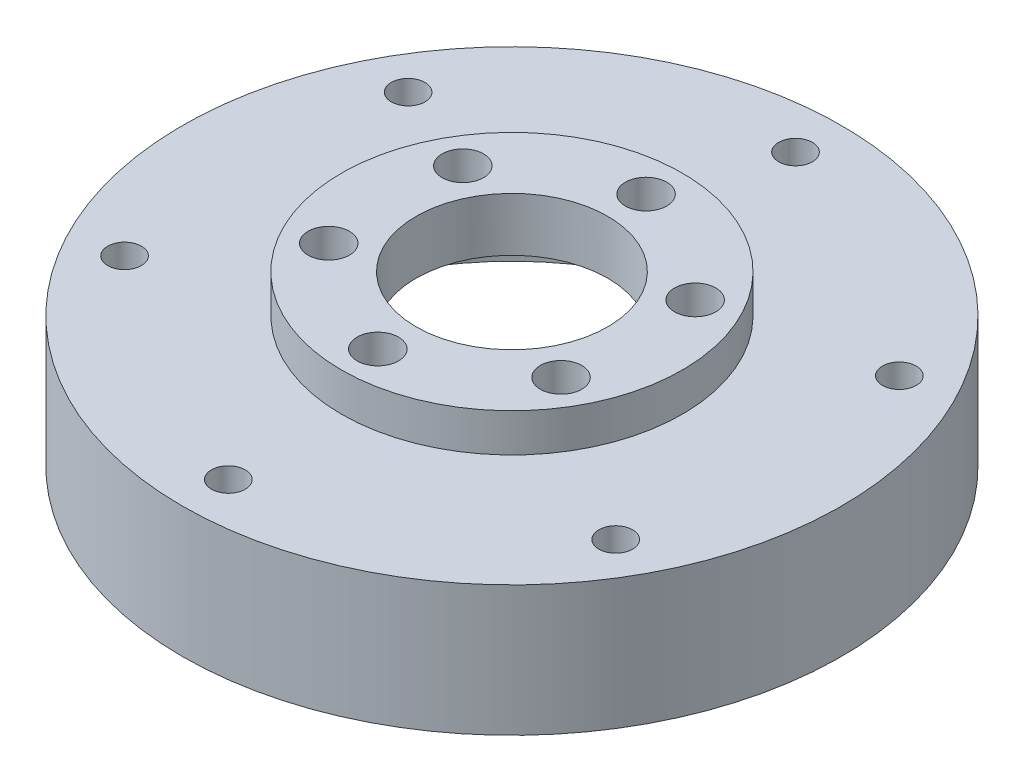
ISO-10303-21;
HEADER;
FILE_DESCRIPTION(('STEP AP214'),'2;1');
FILE_NAME('part.step','',(''),(''),'','','');
FILE_SCHEMA(('AUTOMOTIVE_DESIGN { 1 0 10303 214 1 1 1 1 }'));
ENDSEC;
DATA;
#1=APPLICATION_CONTEXT('core data for automotive mechanical design processes');
#2=APPLICATION_PROTOCOL_DEFINITION('international standard','automotive_design',2000,#1);
#3=PRODUCT_CONTEXT('',#1,'mechanical');
#4=PRODUCT('Part','Part','',(#3));
#5=PRODUCT_RELATED_PRODUCT_CATEGORY('part','',(#4));
#6=PRODUCT_DEFINITION_FORMATION('','',#4);
#7=PRODUCT_DEFINITION_CONTEXT('part definition',#1,'design');
#8=PRODUCT_DEFINITION('design','',#6,#7);
#9=PRODUCT_DEFINITION_SHAPE('','',#8);
#10=(LENGTH_UNIT() NAMED_UNIT(*) SI_UNIT(.MILLI.,.METRE.));
#11=(NAMED_UNIT(*) PLANE_ANGLE_UNIT() SI_UNIT($,.RADIAN.));
#12=(NAMED_UNIT(*) SI_UNIT($,.STERADIAN.) SOLID_ANGLE_UNIT());
#13=UNCERTAINTY_MEASURE_WITH_UNIT(LENGTH_MEASURE(1.E-05),#10,'distance_accuracy_value','');
#14=(GEOMETRIC_REPRESENTATION_CONTEXT(3) GLOBAL_UNCERTAINTY_ASSIGNED_CONTEXT((#13)) GLOBAL_UNIT_ASSIGNED_CONTEXT((#10,
#11,#12)) REPRESENTATION_CONTEXT('',''));
#15=CARTESIAN_POINT('',(0.,0.,0.));
#16=DIRECTION('',(0.,0.,1.));
#17=DIRECTION('',(1.,0.,0.));
#18=AXIS2_PLACEMENT_3D('',#15,#16,#17);
#19=CARTESIAN_POINT('',(0.,17.,0.));
#20=DIRECTION('',(0.,-1.,0.));
#21=DIRECTION('',(0.,0.,-1.));
#22=AXIS2_PLACEMENT_3D('',#19,#20,#21);
#23=CYLINDRICAL_SURFACE('',#22,43.);
#24=CARTESIAN_POINT('',(0.,17.,0.));
#25=DIRECTION('',(0.,1.,0.));
#26=DIRECTION('',(0.,0.,1.));
#27=AXIS2_PLACEMENT_3D('',#24,#25,#26);
#28=CIRCLE('',#27,43.);
#29=CARTESIAN_POINT('',(0.,17.,43.));
#30=VERTEX_POINT('',#29);
#31=EDGE_CURVE('E44',#30,#30,#28,.T.);
#32=ORIENTED_EDGE('',*,*,#31,.F.);
#33=EDGE_LOOP('',(#32));
#34=FACE_BOUND('',#33,.T.);
#35=CARTESIAN_POINT('',(0.,0.,0.));
#36=DIRECTION('',(0.,1.,0.));
#37=DIRECTION('',(0.,0.,1.));
#38=AXIS2_PLACEMENT_3D('',#35,#36,#37);
#39=CIRCLE('',#38,43.);
#40=CARTESIAN_POINT('',(0.,0.,43.));
#41=VERTEX_POINT('',#40);
#42=EDGE_CURVE('E49',#41,#41,#39,.T.);
#43=ORIENTED_EDGE('',*,*,#42,.T.);
#44=EDGE_LOOP('',(#43));
#45=FACE_BOUND('',#44,.T.);
#46=ADVANCED_FACE('F37',(#34,#45),#23,.T.);
#47=CARTESIAN_POINT('',(0.,17.,0.));
#48=DIRECTION('',(0.,1.,0.));
#49=DIRECTION('',(0.,0.,1.));
#50=AXIS2_PLACEMENT_3D('',#47,#48,#49);
#51=PLANE('',#50);
#52=CARTESIAN_POINT('',(32.042939940024,17.,-18.5000000000004));
#53=DIRECTION('',(0.,1.,0.));
#54=DIRECTION('',(-0.866025403784433,0.,0.50000000000001));
#55=AXIS2_PLACEMENT_3D('',#52,#53,#54);
#56=CIRCLE('',#55,2.2);
#57=CARTESIAN_POINT('',(30.1376840516983,17.,-17.4000000000004));
#58=VERTEX_POINT('',#57);
#59=EDGE_CURVE('E120',#58,#58,#56,.T.);
#60=ORIENTED_EDGE('',*,*,#59,.F.);
#61=EDGE_LOOP('',(#60));
#62=FACE_BOUND('',#61,.T.);
#63=CARTESIAN_POINT('',(32.0429399400244,17.,18.4999999999997));
#64=DIRECTION('',(0.,1.,0.));
#65=DIRECTION('',(-0.866025403784443,0.,-0.499999999999992));
#66=AXIS2_PLACEMENT_3D('',#63,#64,#65);
#67=CIRCLE('',#66,2.2);
#68=CARTESIAN_POINT('',(30.1376840516986,17.,17.3999999999997));
#69=VERTEX_POINT('',#68);
#70=EDGE_CURVE('E126',#69,#69,#67,.T.);
#71=ORIENTED_EDGE('',*,*,#70,.F.);
#72=EDGE_LOOP('',(#71));
#73=FACE_BOUND('',#72,.T.);
#74=CARTESIAN_POINT('',(0.,17.,37.));
#75=DIRECTION('',(0.,1.,0.));
#76=DIRECTION('',(0.,0.,-1.));
#77=AXIS2_PLACEMENT_3D('',#74,#75,#76);
#78=CIRCLE('',#77,2.2);
#79=CARTESIAN_POINT('',(0.,17.,34.8));
#80=VERTEX_POINT('',#79);
#81=EDGE_CURVE('E132',#80,#80,#78,.T.);
#82=ORIENTED_EDGE('',*,*,#81,.F.);
#83=EDGE_LOOP('',(#82));
#84=FACE_BOUND('',#83,.T.);
#85=CARTESIAN_POINT('',(-32.0429399400241,17.,18.5000000000002));
#86=DIRECTION('',(0.,1.,0.));
#87=DIRECTION('',(0.866025403784436,0.,-0.500000000000004));
#88=AXIS2_PLACEMENT_3D('',#85,#86,#87);
#89=CIRCLE('',#88,2.2);
#90=CARTESIAN_POINT('',(-30.1376840516984,17.,17.4000000000001));
#91=VERTEX_POINT('',#90);
#92=EDGE_CURVE('E138',#91,#91,#89,.T.);
#93=ORIENTED_EDGE('',*,*,#92,.F.);
#94=EDGE_LOOP('',(#93));
#95=FACE_BOUND('',#94,.T.);
#96=CARTESIAN_POINT('',(-32.0429399400243,17.,-18.4999999999999));
#97=DIRECTION('',(0.,1.,0.));
#98=DIRECTION('',(0.86602540378444,0.,0.499999999999998));
#99=AXIS2_PLACEMENT_3D('',#96,#97,#98);
#100=CIRCLE('',#99,2.2);
#101=CARTESIAN_POINT('',(-30.1376840516985,17.,-17.3999999999999));
#102=VERTEX_POINT('',#101);
#103=EDGE_CURVE('E114',#102,#102,#100,.T.);
#104=ORIENTED_EDGE('',*,*,#103,.F.);
#105=EDGE_LOOP('',(#104));
#106=FACE_BOUND('',#105,.T.);
#107=CARTESIAN_POINT('',(0.,17.,-37.));
#108=DIRECTION('',(0.,1.,0.));
#109=DIRECTION('',(0.,0.,1.));
#110=AXIS2_PLACEMENT_3D('',#107,#108,#109);
#111=CIRCLE('',#110,2.2);
#112=CARTESIAN_POINT('',(0.,17.,-34.8));
#113=VERTEX_POINT('',#112);
#114=EDGE_CURVE('E108',#113,#113,#111,.T.);
#115=ORIENTED_EDGE('',*,*,#114,.F.);
#116=EDGE_LOOP('',(#115));
#117=FACE_BOUND('',#116,.T.);
#118=CARTESIAN_POINT('',(0.,17.,0.));
#119=DIRECTION('',(0.,1.,0.));
#120=DIRECTION('',(0.,0.,1.));
#121=AXIS2_PLACEMENT_3D('',#118,#119,#120);
#122=CIRCLE('',#121,22.244);
#123=CARTESIAN_POINT('',(0.,17.,22.244));
#124=VERTEX_POINT('',#123);
#125=EDGE_CURVE('E10',#124,#124,#122,.T.);
#126=ORIENTED_EDGE('',*,*,#125,.F.);
#127=EDGE_LOOP('',(#126));
#128=FACE_BOUND('',#127,.T.);
#129=ORIENTED_EDGE('',*,*,#31,.T.);
#130=EDGE_LOOP('',(#129));
#131=FACE_BOUND('',#130,.T.);
#132=ADVANCED_FACE('F155',(#62,#73,#84,#95,#106,#117,#128,#131),#51,.T.);
#133=CARTESIAN_POINT('',(0.,0.,0.));
#134=DIRECTION('',(0.,1.,0.));
#135=DIRECTION('',(0.,0.,1.));
#136=AXIS2_PLACEMENT_3D('',#133,#134,#135);
#137=PLANE('',#136);
#138=CARTESIAN_POINT('',(32.042939940024,0.,-18.5000000000004));
#139=DIRECTION('',(0.,1.,0.));
#140=DIRECTION('',(-0.866025403784433,0.,0.50000000000001));
#141=AXIS2_PLACEMENT_3D('',#138,#139,#140);
#142=CIRCLE('',#141,2.2);
#143=CARTESIAN_POINT('',(30.1376840516983,0.,-17.4000000000004));
#144=VERTEX_POINT('',#143);
#145=EDGE_CURVE('E123',#144,#144,#142,.T.);
#146=ORIENTED_EDGE('',*,*,#145,.T.);
#147=EDGE_LOOP('',(#146));
#148=FACE_BOUND('',#147,.T.);
#149=CARTESIAN_POINT('',(32.0429399400244,0.,18.4999999999997));
#150=DIRECTION('',(0.,1.,0.));
#151=DIRECTION('',(-0.866025403784443,0.,-0.499999999999992));
#152=AXIS2_PLACEMENT_3D('',#149,#150,#151);
#153=CIRCLE('',#152,2.2);
#154=CARTESIAN_POINT('',(30.1376840516986,0.,17.3999999999997));
#155=VERTEX_POINT('',#154);
#156=EDGE_CURVE('E129',#155,#155,#153,.T.);
#157=ORIENTED_EDGE('',*,*,#156,.T.);
#158=EDGE_LOOP('',(#157));
#159=FACE_BOUND('',#158,.T.);
#160=CARTESIAN_POINT('',(0.,0.,37.));
#161=DIRECTION('',(0.,1.,0.));
#162=DIRECTION('',(0.,0.,-1.));
#163=AXIS2_PLACEMENT_3D('',#160,#161,#162);
#164=CIRCLE('',#163,2.2);
#165=CARTESIAN_POINT('',(0.,0.,34.8));
#166=VERTEX_POINT('',#165);
#167=EDGE_CURVE('E135',#166,#166,#164,.T.);
#168=ORIENTED_EDGE('',*,*,#167,.T.);
#169=EDGE_LOOP('',(#168));
#170=FACE_BOUND('',#169,.T.);
#171=CARTESIAN_POINT('',(-32.0429399400241,0.,18.5000000000002));
#172=DIRECTION('',(0.,1.,0.));
#173=DIRECTION('',(0.866025403784436,0.,-0.500000000000004));
#174=AXIS2_PLACEMENT_3D('',#171,#172,#173);
#175=CIRCLE('',#174,2.2);
#176=CARTESIAN_POINT('',(-30.1376840516984,0.,17.4000000000001));
#177=VERTEX_POINT('',#176);
#178=EDGE_CURVE('E117',#177,#177,#175,.T.);
#179=ORIENTED_EDGE('',*,*,#178,.T.);
#180=EDGE_LOOP('',(#179));
#181=FACE_BOUND('',#180,.T.);
#182=CARTESIAN_POINT('',(-32.0429399400243,0.,-18.4999999999999));
#183=DIRECTION('',(0.,1.,0.));
#184=DIRECTION('',(0.86602540378444,0.,0.499999999999998));
#185=AXIS2_PLACEMENT_3D('',#182,#183,#184);
#186=CIRCLE('',#185,2.2);
#187=CARTESIAN_POINT('',(-30.1376840516985,0.,-17.3999999999999));
#188=VERTEX_POINT('',#187);
#189=EDGE_CURVE('E111',#188,#188,#186,.T.);
#190=ORIENTED_EDGE('',*,*,#189,.T.);
#191=EDGE_LOOP('',(#190));
#192=FACE_BOUND('',#191,.T.);
#193=CARTESIAN_POINT('',(0.,0.,-37.));
#194=DIRECTION('',(0.,1.,0.));
#195=DIRECTION('',(0.,0.,1.));
#196=AXIS2_PLACEMENT_3D('',#193,#194,#195);
#197=CIRCLE('',#196,2.2);
#198=CARTESIAN_POINT('',(0.,0.,-34.8));
#199=VERTEX_POINT('',#198);
#200=EDGE_CURVE('E88',#199,#199,#197,.T.);
#201=ORIENTED_EDGE('',*,*,#200,.T.);
#202=EDGE_LOOP('',(#201));
#203=FACE_BOUND('',#202,.T.);
#204=CARTESIAN_POINT('',(0.,0.,0.));
#205=DIRECTION('',(0.,-1.,0.));
#206=DIRECTION('',(0.,0.,-1.));
#207=AXIS2_PLACEMENT_3D('',#204,#205,#206);
#208=CIRCLE('',#207,32.76);
#209=CARTESIAN_POINT('',(0.,0.,-32.76));
#210=VERTEX_POINT('',#209);
#211=EDGE_CURVE('E62',#210,#210,#208,.T.);
#212=ORIENTED_EDGE('',*,*,#211,.F.);
#213=EDGE_LOOP('',(#212));
#214=FACE_BOUND('',#213,.T.);
#215=ORIENTED_EDGE('',*,*,#42,.F.);
#216=EDGE_LOOP('',(#215));
#217=FACE_BOUND('',#216,.T.);
#218=ADVANCED_FACE('F144',(#148,#159,#170,#181,#192,#203,#214,#217),#137,.F.);
#219=CARTESIAN_POINT('',(0.,22.,0.));
#220=DIRECTION('',(0.,-1.,0.));
#221=DIRECTION('',(0.,0.,-1.));
#222=AXIS2_PLACEMENT_3D('',#219,#220,#221);
#223=CYLINDRICAL_SURFACE('',#222,22.244);
#224=CARTESIAN_POINT('',(0.,22.,0.));
#225=DIRECTION('',(0.,1.,0.));
#226=DIRECTION('',(0.,0.,1.));
#227=AXIS2_PLACEMENT_3D('',#224,#225,#226);
#228=CIRCLE('',#227,22.244);
#229=CARTESIAN_POINT('',(0.,22.,22.244));
#230=VERTEX_POINT('',#229);
#231=EDGE_CURVE('E52',#230,#230,#228,.T.);
#232=ORIENTED_EDGE('',*,*,#231,.F.);
#233=EDGE_LOOP('',(#232));
#234=FACE_BOUND('',#233,.T.);
#235=ORIENTED_EDGE('',*,*,#125,.T.);
#236=EDGE_LOOP('',(#235));
#237=FACE_BOUND('',#236,.T.);
#238=ADVANCED_FACE('F175',(#234,#237),#223,.T.);
#239=CARTESIAN_POINT('',(0.,22.,0.));
#240=DIRECTION('',(0.,1.,0.));
#241=DIRECTION('',(0.,0.,1.));
#242=AXIS2_PLACEMENT_3D('',#239,#240,#241);
#243=PLANE('',#242);
#244=CARTESIAN_POINT('',(15.1554445662276,22.,-8.75000000000018));
#245=DIRECTION('',(0.,1.,0.));
#246=DIRECTION('',(-0.866025403784433,0.,0.50000000000001));
#247=AXIS2_PLACEMENT_3D('',#244,#245,#246);
#248=CIRCLE('',#247,2.7);
#249=CARTESIAN_POINT('',(12.8171759760096,22.,-7.40000000000015));
#250=VERTEX_POINT('',#249);
#251=EDGE_CURVE('E84',#250,#250,#248,.T.);
#252=ORIENTED_EDGE('',*,*,#251,.F.);
#253=EDGE_LOOP('',(#252));
#254=FACE_BOUND('',#253,.T.);
#255=CARTESIAN_POINT('',(15.1554445662278,22.,8.74999999999986));
#256=DIRECTION('',(0.,1.,0.));
#257=DIRECTION('',(-0.866025403784443,0.,-0.499999999999992));
#258=AXIS2_PLACEMENT_3D('',#255,#256,#257);
#259=CIRCLE('',#258,2.7);
#260=CARTESIAN_POINT('',(12.8171759760098,22.,7.39999999999988));
#261=VERTEX_POINT('',#260);
#262=EDGE_CURVE('E91',#261,#261,#259,.T.);
#263=ORIENTED_EDGE('',*,*,#262,.F.);
#264=EDGE_LOOP('',(#263));
#265=FACE_BOUND('',#264,.T.);
#266=CARTESIAN_POINT('',(0.,22.,17.5));
#267=DIRECTION('',(0.,1.,0.));
#268=DIRECTION('',(0.,0.,-1.));
#269=AXIS2_PLACEMENT_3D('',#266,#267,#268);
#270=CIRCLE('',#269,2.7);
#271=CARTESIAN_POINT('',(0.,22.,14.8));
#272=VERTEX_POINT('',#271);
#273=EDGE_CURVE('E97',#272,#272,#270,.T.);
#274=ORIENTED_EDGE('',*,*,#273,.F.);
#275=EDGE_LOOP('',(#274));
#276=FACE_BOUND('',#275,.T.);
#277=CARTESIAN_POINT('',(-15.1554445662276,22.,8.75000000000007));
#278=DIRECTION('',(0.,1.,0.));
#279=DIRECTION('',(0.866025403784436,0.,-0.500000000000004));
#280=AXIS2_PLACEMENT_3D('',#277,#278,#279);
#281=CIRCLE('',#280,2.7);
#282=CARTESIAN_POINT('',(-12.8171759760097,22.,7.40000000000006));
#283=VERTEX_POINT('',#282);
#284=EDGE_CURVE('E103',#283,#283,#281,.T.);
#285=ORIENTED_EDGE('',*,*,#284,.F.);
#286=EDGE_LOOP('',(#285));
#287=FACE_BOUND('',#286,.T.);
#288=CARTESIAN_POINT('',(-15.1554445662277,22.,-8.74999999999997));
#289=DIRECTION('',(0.,1.,0.));
#290=DIRECTION('',(0.86602540378444,0.,0.499999999999998));
#291=AXIS2_PLACEMENT_3D('',#288,#289,#290);
#292=CIRCLE('',#291,2.7);
#293=CARTESIAN_POINT('',(-12.8171759760097,22.,-7.39999999999997));
#294=VERTEX_POINT('',#293);
#295=EDGE_CURVE('E78',#294,#294,#292,.T.);
#296=ORIENTED_EDGE('',*,*,#295,.F.);
#297=EDGE_LOOP('',(#296));
#298=FACE_BOUND('',#297,.T.);
#299=CARTESIAN_POINT('',(0.,22.,-17.5));
#300=DIRECTION('',(0.,1.,0.));
#301=DIRECTION('',(0.,0.,1.));
#302=AXIS2_PLACEMENT_3D('',#299,#300,#301);
#303=CIRCLE('',#302,2.7);
#304=CARTESIAN_POINT('',(0.,22.,-14.8));
#305=VERTEX_POINT('',#304);
#306=EDGE_CURVE('E72',#305,#305,#303,.T.);
#307=ORIENTED_EDGE('',*,*,#306,.F.);
#308=EDGE_LOOP('',(#307));
#309=FACE_BOUND('',#308,.T.);
#310=CARTESIAN_POINT('',(0.,22.,0.));
#311=DIRECTION('',(0.,1.,0.));
#312=DIRECTION('',(0.,0.,1.));
#313=AXIS2_PLACEMENT_3D('',#310,#311,#312);
#314=CIRCLE('',#313,12.5);
#315=CARTESIAN_POINT('',(0.,22.,12.5));
#316=VERTEX_POINT('',#315);
#317=EDGE_CURVE('E68',#316,#316,#314,.T.);
#318=ORIENTED_EDGE('',*,*,#317,.F.);
#319=EDGE_LOOP('',(#318));
#320=FACE_BOUND('',#319,.T.);
#321=ORIENTED_EDGE('',*,*,#231,.T.);
#322=EDGE_LOOP('',(#321));
#323=FACE_BOUND('',#322,.T.);
#324=ADVANCED_FACE('F179',(#254,#265,#276,#287,#298,#309,#320,#323),#243,.T.);
#325=CARTESIAN_POINT('',(0.,15.,0.));
#326=DIRECTION('',(0.,-1.,0.));
#327=DIRECTION('',(0.,0.,-1.));
#328=AXIS2_PLACEMENT_3D('',#325,#326,#327);
#329=CYLINDRICAL_SURFACE('',#328,32.76);
#330=CARTESIAN_POINT('',(0.,15.,0.));
#331=DIRECTION('',(0.,-1.,0.));
#332=DIRECTION('',(0.,0.,-1.));
#333=AXIS2_PLACEMENT_3D('',#330,#331,#332);
#334=CIRCLE('',#333,32.76);
#335=CARTESIAN_POINT('',(0.,15.,-32.76));
#336=VERTEX_POINT('',#335);
#337=EDGE_CURVE('E58',#336,#336,#334,.T.);
#338=ORIENTED_EDGE('',*,*,#337,.F.);
#339=EDGE_LOOP('',(#338));
#340=FACE_BOUND('',#339,.T.);
#341=ORIENTED_EDGE('',*,*,#211,.T.);
#342=EDGE_LOOP('',(#341));
#343=FACE_BOUND('',#342,.T.);
#344=ADVANCED_FACE('F187',(#340,#343),#329,.F.);
#345=CARTESIAN_POINT('',(0.,15.,0.));
#346=DIRECTION('',(0.,-1.,0.));
#347=DIRECTION('',(0.,0.,-1.));
#348=AXIS2_PLACEMENT_3D('',#345,#346,#347);
#349=PLANE('',#348);
#350=CARTESIAN_POINT('',(0.,15.,0.));
#351=DIRECTION('',(0.,-1.,0.));
#352=DIRECTION('',(0.,0.,-1.));
#353=AXIS2_PLACEMENT_3D('',#350,#351,#352);
#354=CIRCLE('',#353,12.5);
#355=CARTESIAN_POINT('',(0.,15.,-12.5));
#356=VERTEX_POINT('',#355);
#357=EDGE_CURVE('E40',#356,#356,#354,.T.);
#358=ORIENTED_EDGE('',*,*,#357,.F.);
#359=EDGE_LOOP('',(#358));
#360=FACE_BOUND('',#359,.T.);
#361=ORIENTED_EDGE('',*,*,#337,.T.);
#362=EDGE_LOOP('',(#361));
#363=FACE_BOUND('',#362,.T.);
#364=ADVANCED_FACE('F191',(#360,#363),#349,.T.);
#365=CARTESIAN_POINT('',(0.,12.,0.));
#366=DIRECTION('',(0.,1.,0.));
#367=DIRECTION('',(0.,0.,1.));
#368=AXIS2_PLACEMENT_3D('',#365,#366,#367);
#369=CYLINDRICAL_SURFACE('',#368,12.5);
#370=ORIENTED_EDGE('',*,*,#357,.T.);
#371=EDGE_LOOP('',(#370));
#372=FACE_BOUND('',#371,.T.);
#373=ORIENTED_EDGE('',*,*,#317,.T.);
#374=EDGE_LOOP('',(#373));
#375=FACE_BOUND('',#374,.T.);
#376=ADVANCED_FACE('F200',(#372,#375),#369,.F.);
#377=CARTESIAN_POINT('',(0.,15.9,-17.5));
#378=DIRECTION('',(0.,1.,0.));
#379=DIRECTION('',(0.,0.,1.));
#380=AXIS2_PLACEMENT_3D('',#377,#378,#379);
#381=CYLINDRICAL_SURFACE('',#380,2.7);
#382=CARTESIAN_POINT('',(0.,15.9,-17.5));
#383=DIRECTION('',(0.,1.,0.));
#384=DIRECTION('',(0.,0.,1.));
#385=AXIS2_PLACEMENT_3D('',#382,#383,#384);
#386=CIRCLE('',#385,2.7);
#387=CARTESIAN_POINT('',(0.,15.9,-14.8));
#388=VERTEX_POINT('',#387);
#389=EDGE_CURVE('E71',#388,#388,#386,.T.);
#390=ORIENTED_EDGE('',*,*,#389,.F.);
#391=EDGE_LOOP('',(#390));
#392=FACE_BOUND('',#391,.T.);
#393=ORIENTED_EDGE('',*,*,#306,.T.);
#394=EDGE_LOOP('',(#393));
#395=FACE_BOUND('',#394,.T.);
#396=ADVANCED_FACE('F209',(#392,#395),#381,.F.);
#397=CARTESIAN_POINT('',(0.,15.9,-17.5));
#398=DIRECTION('',(0.,1.,0.));
#399=DIRECTION('',(0.,0.,1.));
#400=AXIS2_PLACEMENT_3D('',#397,#398,#399);
#401=PLANE('',#400);
#402=ORIENTED_EDGE('',*,*,#389,.T.);
#403=EDGE_LOOP('',(#402));
#404=FACE_BOUND('',#403,.T.);
#405=ADVANCED_FACE('F218',(#404),#401,.T.);
#406=CARTESIAN_POINT('',(-15.1554445662277,15.9,-8.74999999999997));
#407=DIRECTION('',(0.,1.,0.));
#408=DIRECTION('',(0.,0.,1.));
#409=AXIS2_PLACEMENT_3D('',#406,#407,#408);
#410=CYLINDRICAL_SURFACE('',#409,2.7);
#411=CARTESIAN_POINT('',(-15.1554445662277,15.9,-8.74999999999997));
#412=DIRECTION('',(0.,1.,0.));
#413=DIRECTION('',(0.86602540378444,0.,0.499999999999998));
#414=AXIS2_PLACEMENT_3D('',#411,#412,#413);
#415=CIRCLE('',#414,2.7);
#416=CARTESIAN_POINT('',(-12.8171759760097,15.9,-7.39999999999997));
#417=VERTEX_POINT('',#416);
#418=EDGE_CURVE('E75',#417,#417,#415,.T.);
#419=ORIENTED_EDGE('',*,*,#418,.F.);
#420=EDGE_LOOP('',(#419));
#421=FACE_BOUND('',#420,.T.);
#422=ORIENTED_EDGE('',*,*,#295,.T.);
#423=EDGE_LOOP('',(#422));
#424=FACE_BOUND('',#423,.T.);
#425=ADVANCED_FACE('F227',(#421,#424),#410,.F.);
#426=CARTESIAN_POINT('',(-15.1554445662277,15.9,-8.74999999999997));
#427=DIRECTION('',(0.,1.,0.));
#428=DIRECTION('',(0.86602540378444,0.,0.499999999999998));
#429=AXIS2_PLACEMENT_3D('',#426,#427,#428);
#430=PLANE('',#429);
#431=ORIENTED_EDGE('',*,*,#418,.T.);
#432=EDGE_LOOP('',(#431));
#433=FACE_BOUND('',#432,.T.);
#434=ADVANCED_FACE('F243',(#433),#430,.T.);
#435=CARTESIAN_POINT('',(-15.1554445662276,15.9,8.75000000000007));
#436=DIRECTION('',(0.,1.,0.));
#437=DIRECTION('',(0.,0.,1.));
#438=AXIS2_PLACEMENT_3D('',#435,#436,#437);
#439=CYLINDRICAL_SURFACE('',#438,2.7);
#440=CARTESIAN_POINT('',(-15.1554445662276,15.9,8.75000000000007));
#441=DIRECTION('',(0.,1.,0.));
#442=DIRECTION('',(0.866025403784436,0.,-0.500000000000004));
#443=AXIS2_PLACEMENT_3D('',#440,#441,#442);
#444=CIRCLE('',#443,2.7);
#445=CARTESIAN_POINT('',(-12.8171759760097,15.9,7.40000000000006));
#446=VERTEX_POINT('',#445);
#447=EDGE_CURVE('E81',#446,#446,#444,.T.);
#448=ORIENTED_EDGE('',*,*,#447,.F.);
#449=EDGE_LOOP('',(#448));
#450=FACE_BOUND('',#449,.T.);
#451=ORIENTED_EDGE('',*,*,#284,.T.);
#452=EDGE_LOOP('',(#451));
#453=FACE_BOUND('',#452,.T.);
#454=ADVANCED_FACE('F252',(#450,#453),#439,.F.);
#455=CARTESIAN_POINT('',(-15.1554445662276,15.9,8.75000000000007));
#456=DIRECTION('',(0.,1.,0.));
#457=DIRECTION('',(0.866025403784436,0.,-0.500000000000004));
#458=AXIS2_PLACEMENT_3D('',#455,#456,#457);
#459=PLANE('',#458);
#460=ORIENTED_EDGE('',*,*,#447,.T.);
#461=EDGE_LOOP('',(#460));
#462=FACE_BOUND('',#461,.T.);
#463=ADVANCED_FACE('F261',(#462),#459,.T.);
#464=CARTESIAN_POINT('',(0.,15.9,17.5));
#465=DIRECTION('',(0.,1.,0.));
#466=DIRECTION('',(0.,0.,1.));
#467=AXIS2_PLACEMENT_3D('',#464,#465,#466);
#468=CYLINDRICAL_SURFACE('',#467,2.7);
#469=CARTESIAN_POINT('',(0.,15.9,17.5));
#470=DIRECTION('',(0.,1.,0.));
#471=DIRECTION('',(0.,0.,-1.));
#472=AXIS2_PLACEMENT_3D('',#469,#470,#471);
#473=CIRCLE('',#472,2.7);
#474=CARTESIAN_POINT('',(0.,15.9,14.8));
#475=VERTEX_POINT('',#474);
#476=EDGE_CURVE('E100',#475,#475,#473,.T.);
#477=ORIENTED_EDGE('',*,*,#476,.F.);
#478=EDGE_LOOP('',(#477));
#479=FACE_BOUND('',#478,.T.);
#480=ORIENTED_EDGE('',*,*,#273,.T.);
#481=EDGE_LOOP('',(#480));
#482=FACE_BOUND('',#481,.T.);
#483=ADVANCED_FACE('F270',(#479,#482),#468,.F.);
#484=CARTESIAN_POINT('',(0.,15.9,17.5));
#485=DIRECTION('',(0.,1.,0.));
#486=DIRECTION('',(0.,0.,-1.));
#487=AXIS2_PLACEMENT_3D('',#484,#485,#486);
#488=PLANE('',#487);
#489=ORIENTED_EDGE('',*,*,#476,.T.);
#490=EDGE_LOOP('',(#489));
#491=FACE_BOUND('',#490,.T.);
#492=ADVANCED_FACE('F279',(#491),#488,.T.);
#493=CARTESIAN_POINT('',(15.1554445662278,15.9,8.74999999999986));
#494=DIRECTION('',(0.,1.,0.));
#495=DIRECTION('',(0.,0.,1.));
#496=AXIS2_PLACEMENT_3D('',#493,#494,#495);
#497=CYLINDRICAL_SURFACE('',#496,2.7);
#498=CARTESIAN_POINT('',(15.1554445662278,15.9,8.74999999999986));
#499=DIRECTION('',(0.,1.,0.));
#500=DIRECTION('',(-0.866025403784443,0.,-0.499999999999992));
#501=AXIS2_PLACEMENT_3D('',#498,#499,#500);
#502=CIRCLE('',#501,2.7);
#503=CARTESIAN_POINT('',(12.8171759760098,15.9,7.39999999999988));
#504=VERTEX_POINT('',#503);
#505=EDGE_CURVE('E94',#504,#504,#502,.T.);
#506=ORIENTED_EDGE('',*,*,#505,.F.);
#507=EDGE_LOOP('',(#506));
#508=FACE_BOUND('',#507,.T.);
#509=ORIENTED_EDGE('',*,*,#262,.T.);
#510=EDGE_LOOP('',(#509));
#511=FACE_BOUND('',#510,.T.);
#512=ADVANCED_FACE('F288',(#508,#511),#497,.F.);
#513=CARTESIAN_POINT('',(15.1554445662278,15.9,8.74999999999986));
#514=DIRECTION('',(0.,1.,0.));
#515=DIRECTION('',(-0.866025403784443,0.,-0.499999999999992));
#516=AXIS2_PLACEMENT_3D('',#513,#514,#515);
#517=PLANE('',#516);
#518=ORIENTED_EDGE('',*,*,#505,.T.);
#519=EDGE_LOOP('',(#518));
#520=FACE_BOUND('',#519,.T.);
#521=ADVANCED_FACE('F297',(#520),#517,.T.);
#522=CARTESIAN_POINT('',(15.1554445662276,15.9,-8.75000000000018));
#523=DIRECTION('',(0.,1.,0.));
#524=DIRECTION('',(0.,0.,1.));
#525=AXIS2_PLACEMENT_3D('',#522,#523,#524);
#526=CYLINDRICAL_SURFACE('',#525,2.7);
#527=CARTESIAN_POINT('',(15.1554445662276,15.9,-8.75000000000018));
#528=DIRECTION('',(0.,1.,0.));
#529=DIRECTION('',(-0.866025403784433,0.,0.50000000000001));
#530=AXIS2_PLACEMENT_3D('',#527,#528,#529);
#531=CIRCLE('',#530,2.7);
#532=CARTESIAN_POINT('',(12.8171759760096,15.9,-7.40000000000015));
#533=VERTEX_POINT('',#532);
#534=EDGE_CURVE('E87',#533,#533,#531,.T.);
#535=ORIENTED_EDGE('',*,*,#534,.F.);
#536=EDGE_LOOP('',(#535));
#537=FACE_BOUND('',#536,.T.);
#538=ORIENTED_EDGE('',*,*,#251,.T.);
#539=EDGE_LOOP('',(#538));
#540=FACE_BOUND('',#539,.T.);
#541=ADVANCED_FACE('F306',(#537,#540),#526,.F.);
#542=CARTESIAN_POINT('',(15.1554445662276,15.9,-8.75000000000018));
#543=DIRECTION('',(0.,1.,0.));
#544=DIRECTION('',(-0.866025403784433,0.,0.50000000000001));
#545=AXIS2_PLACEMENT_3D('',#542,#543,#544);
#546=PLANE('',#545);
#547=ORIENTED_EDGE('',*,*,#534,.T.);
#548=EDGE_LOOP('',(#547));
#549=FACE_BOUND('',#548,.T.);
#550=ADVANCED_FACE('F315',(#549),#546,.T.);
#551=CARTESIAN_POINT('',(0.,0.,-37.));
#552=DIRECTION('',(0.,1.,0.));
#553=DIRECTION('',(0.,0.,1.));
#554=AXIS2_PLACEMENT_3D('',#551,#552,#553);
#555=CYLINDRICAL_SURFACE('',#554,2.2);
#556=ORIENTED_EDGE('',*,*,#200,.F.);
#557=EDGE_LOOP('',(#556));
#558=FACE_BOUND('',#557,.T.);
#559=ORIENTED_EDGE('',*,*,#114,.T.);
#560=EDGE_LOOP('',(#559));
#561=FACE_BOUND('',#560,.T.);
#562=ADVANCED_FACE('F324',(#558,#561),#555,.F.);
#563=CARTESIAN_POINT('',(-32.0429399400243,0.,-18.4999999999999));
#564=DIRECTION('',(0.,1.,0.));
#565=DIRECTION('',(0.,0.,1.));
#566=AXIS2_PLACEMENT_3D('',#563,#564,#565);
#567=CYLINDRICAL_SURFACE('',#566,2.2);
#568=ORIENTED_EDGE('',*,*,#189,.F.);
#569=EDGE_LOOP('',(#568));
#570=FACE_BOUND('',#569,.T.);
#571=ORIENTED_EDGE('',*,*,#103,.T.);
#572=EDGE_LOOP('',(#571));
#573=FACE_BOUND('',#572,.T.);
#574=ADVANCED_FACE('F151',(#570,#573),#567,.F.);
#575=CARTESIAN_POINT('',(-32.0429399400241,0.,18.5000000000002));
#576=DIRECTION('',(0.,1.,0.));
#577=DIRECTION('',(0.,0.,1.));
#578=AXIS2_PLACEMENT_3D('',#575,#576,#577);
#579=CYLINDRICAL_SURFACE('',#578,2.2);
#580=ORIENTED_EDGE('',*,*,#178,.F.);
#581=EDGE_LOOP('',(#580));
#582=FACE_BOUND('',#581,.T.);
#583=ORIENTED_EDGE('',*,*,#92,.T.);
#584=EDGE_LOOP('',(#583));
#585=FACE_BOUND('',#584,.T.);
#586=ADVANCED_FACE('F147',(#582,#585),#579,.F.);
#587=CARTESIAN_POINT('',(0.,0.,37.));
#588=DIRECTION('',(0.,1.,0.));
#589=DIRECTION('',(0.,0.,1.));
#590=AXIS2_PLACEMENT_3D('',#587,#588,#589);
#591=CYLINDRICAL_SURFACE('',#590,2.2);
#592=ORIENTED_EDGE('',*,*,#167,.F.);
#593=EDGE_LOOP('',(#592));
#594=FACE_BOUND('',#593,.T.);
#595=ORIENTED_EDGE('',*,*,#81,.T.);
#596=EDGE_LOOP('',(#595));
#597=FACE_BOUND('',#596,.T.);
#598=ADVANCED_FACE('F150',(#594,#597),#591,.F.);
#599=CARTESIAN_POINT('',(32.0429399400244,0.,18.4999999999997));
#600=DIRECTION('',(0.,1.,0.));
#601=DIRECTION('',(0.,0.,1.));
#602=AXIS2_PLACEMENT_3D('',#599,#600,#601);
#603=CYLINDRICAL_SURFACE('',#602,2.2);
#604=ORIENTED_EDGE('',*,*,#156,.F.);
#605=EDGE_LOOP('',(#604));
#606=FACE_BOUND('',#605,.T.);
#607=ORIENTED_EDGE('',*,*,#70,.T.);
#608=EDGE_LOOP('',(#607));
#609=FACE_BOUND('',#608,.T.);
#610=ADVANCED_FACE('F364',(#606,#609),#603,.F.);
#611=CARTESIAN_POINT('',(32.042939940024,0.,-18.5000000000004));
#612=DIRECTION('',(0.,1.,0.));
#613=DIRECTION('',(0.,0.,1.));
#614=AXIS2_PLACEMENT_3D('',#611,#612,#613);
#615=CYLINDRICAL_SURFACE('',#614,2.2);
#616=ORIENTED_EDGE('',*,*,#145,.F.);
#617=EDGE_LOOP('',(#616));
#618=FACE_BOUND('',#617,.T.);
#619=ORIENTED_EDGE('',*,*,#59,.T.);
#620=EDGE_LOOP('',(#619));
#621=FACE_BOUND('',#620,.T.);
#622=ADVANCED_FACE('F373',(#618,#621),#615,.F.);
#623=CLOSED_SHELL('',(#46,#132,#218,#238,#324,#344,#364,#376,#396,#405,#425,#434,#454,#463,#483,
#492,#512,#521,#541,#550,#562,#574,#586,#598,#610,#622));
#624=MANIFOLD_SOLID_BREP('B2',#623);
#625=ADVANCED_BREP_SHAPE_REPRESENTATION('',(#18,#624),#14);
#626=SHAPE_DEFINITION_REPRESENTATION(#9,#625);
ENDSEC;
END-ISO-10303-21;
